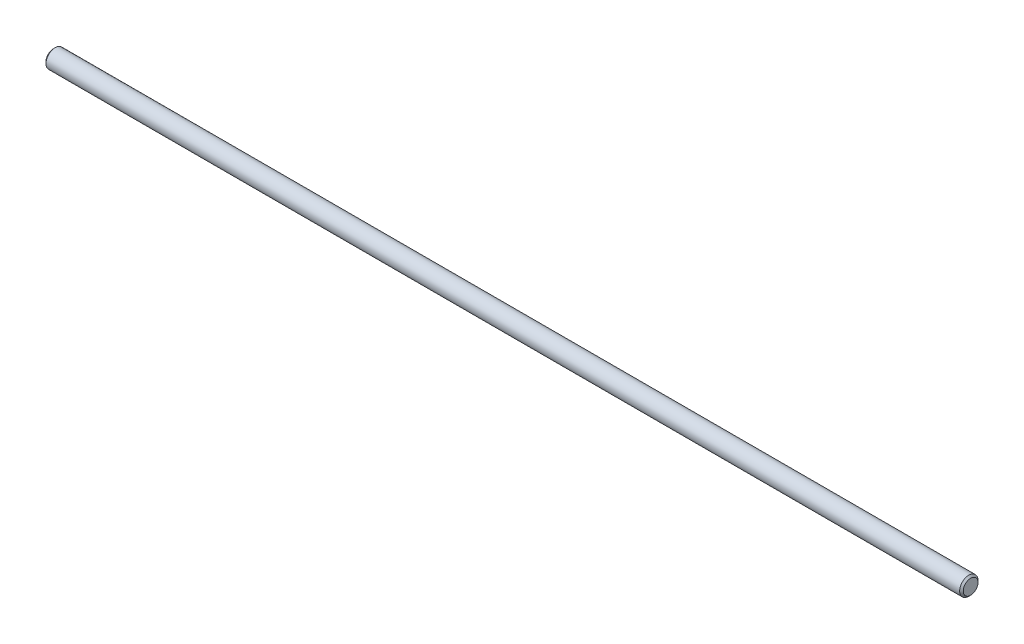
ISO-10303-21;
HEADER;
FILE_DESCRIPTION(('STEP AP214'),'2;1');
FILE_NAME('part.step','',(''),(''),'','','');
FILE_SCHEMA(('AUTOMOTIVE_DESIGN { 1 0 10303 214 1 1 1 1 }'));
ENDSEC;
DATA;
#1=APPLICATION_CONTEXT('core data for automotive mechanical design processes');
#2=APPLICATION_PROTOCOL_DEFINITION('international standard','automotive_design',2000,#1);
#3=PRODUCT_CONTEXT('',#1,'mechanical');
#4=PRODUCT('Part','Part','',(#3));
#5=PRODUCT_RELATED_PRODUCT_CATEGORY('part','',(#4));
#6=PRODUCT_DEFINITION_FORMATION('','',#4);
#7=PRODUCT_DEFINITION_CONTEXT('part definition',#1,'design');
#8=PRODUCT_DEFINITION('design','',#6,#7);
#9=PRODUCT_DEFINITION_SHAPE('','',#8);
#10=(LENGTH_UNIT() NAMED_UNIT(*) SI_UNIT(.MILLI.,.METRE.));
#11=(NAMED_UNIT(*) PLANE_ANGLE_UNIT() SI_UNIT($,.RADIAN.));
#12=(NAMED_UNIT(*) SI_UNIT($,.STERADIAN.) SOLID_ANGLE_UNIT());
#13=UNCERTAINTY_MEASURE_WITH_UNIT(LENGTH_MEASURE(1.E-05),#10,'distance_accuracy_value','');
#14=(GEOMETRIC_REPRESENTATION_CONTEXT(3) GLOBAL_UNCERTAINTY_ASSIGNED_CONTEXT((#13)) GLOBAL_UNIT_ASSIGNED_CONTEXT((#10,
#11,#12)) REPRESENTATION_CONTEXT('',''));
#15=CARTESIAN_POINT('',(0.,0.,0.));
#16=DIRECTION('',(0.,0.,1.));
#17=DIRECTION('',(1.,0.,0.));
#18=AXIS2_PLACEMENT_3D('',#15,#16,#17);
#19=CARTESIAN_POINT('',(0.,0.,0.));
#20=DIRECTION('',(1.,0.,0.));
#21=DIRECTION('',(0.,0.,-1.));
#22=AXIS2_PLACEMENT_3D('',#19,#20,#21);
#23=PLANE('',#22);
#24=CARTESIAN_POINT('',(0.,0.,0.));
#25=DIRECTION('',(-1.,0.,0.));
#26=DIRECTION('',(0.,0.,1.));
#27=AXIS2_PLACEMENT_3D('',#24,#25,#26);
#28=CIRCLE('',#27,2.00999999999998);
#29=CARTESIAN_POINT('',(0.,0.,2.00999999999998));
#30=VERTEX_POINT('',#29);
#31=EDGE_CURVE('E10',#30,#30,#28,.T.);
#32=ORIENTED_EDGE('',*,*,#31,.T.);
#33=EDGE_LOOP('',(#32));
#34=FACE_BOUND('',#33,.T.);
#35=ADVANCED_FACE('F45',(#34),#23,.F.);
#36=CARTESIAN_POINT('',(0.489999999999991,0.,0.));
#37=DIRECTION('',(1.,0.,0.));
#38=DIRECTION('',(0.,0.,-1.));
#39=AXIS2_PLACEMENT_3D('',#36,#37,#38);
#40=CONICAL_SURFACE('',#39,2.5,0.78539816339748);
#41=ORIENTED_EDGE('',*,*,#31,.F.);
#42=EDGE_LOOP('',(#41));
#43=FACE_BOUND('',#42,.T.);
#44=CARTESIAN_POINT('',(0.489999999999991,0.,0.));
#45=DIRECTION('',(-1.,0.,0.));
#46=DIRECTION('',(0.,0.,1.));
#47=AXIS2_PLACEMENT_3D('',#44,#45,#46);
#48=CIRCLE('',#47,2.5);
#49=CARTESIAN_POINT('',(0.489999999999991,0.,2.5));
#50=VERTEX_POINT('',#49);
#51=EDGE_CURVE('E51',#50,#50,#48,.T.);
#52=ORIENTED_EDGE('',*,*,#51,.T.);
#53=EDGE_LOOP('',(#52));
#54=FACE_BOUND('',#53,.T.);
#55=ADVANCED_FACE('F77',(#43,#54),#40,.T.);
#56=CARTESIAN_POINT('',(0.,0.,0.));
#57=DIRECTION('',(-1.,0.,0.));
#58=DIRECTION('',(0.,0.,1.));
#59=AXIS2_PLACEMENT_3D('',#56,#57,#58);
#60=CYLINDRICAL_SURFACE('',#59,2.5);
#61=ORIENTED_EDGE('',*,*,#51,.F.);
#62=EDGE_LOOP('',(#61));
#63=FACE_BOUND('',#62,.T.);
#64=CARTESIAN_POINT('',(249.51,0.,0.));
#65=DIRECTION('',(-1.,0.,0.));
#66=DIRECTION('',(0.,0.,1.));
#67=AXIS2_PLACEMENT_3D('',#64,#65,#66);
#68=CIRCLE('',#67,2.5);
#69=CARTESIAN_POINT('',(249.51,0.,2.5));
#70=VERTEX_POINT('',#69);
#71=EDGE_CURVE('E55',#70,#70,#68,.T.);
#72=ORIENTED_EDGE('',*,*,#71,.T.);
#73=EDGE_LOOP('',(#72));
#74=FACE_BOUND('',#73,.T.);
#75=ADVANCED_FACE('F73',(#63,#74),#60,.T.);
#76=CARTESIAN_POINT('',(250.,0.,0.));
#77=DIRECTION('',(-1.,0.,0.));
#78=DIRECTION('',(0.,0.,1.));
#79=AXIS2_PLACEMENT_3D('',#76,#77,#78);
#80=CONICAL_SURFACE('',#79,2.00999999999998,0.785398163397481);
#81=ORIENTED_EDGE('',*,*,#71,.F.);
#82=EDGE_LOOP('',(#81));
#83=FACE_BOUND('',#82,.T.);
#84=CARTESIAN_POINT('',(250.,0.,0.));
#85=DIRECTION('',(-1.,0.,0.));
#86=DIRECTION('',(0.,0.,1.));
#87=AXIS2_PLACEMENT_3D('',#84,#85,#86);
#88=CIRCLE('',#87,2.00999999999998);
#89=CARTESIAN_POINT('',(250.,0.,2.00999999999998));
#90=VERTEX_POINT('',#89);
#91=EDGE_CURVE('E59',#90,#90,#88,.T.);
#92=ORIENTED_EDGE('',*,*,#91,.T.);
#93=EDGE_LOOP('',(#92));
#94=FACE_BOUND('',#93,.T.);
#95=ADVANCED_FACE('F65',(#83,#94),#80,.T.);
#96=CARTESIAN_POINT('',(250.,2.00999999999998,0.));
#97=DIRECTION('',(-1.,0.,0.));
#98=DIRECTION('',(0.,0.,1.));
#99=AXIS2_PLACEMENT_3D('',#96,#97,#98);
#100=PLANE('',#99);
#101=ORIENTED_EDGE('',*,*,#91,.F.);
#102=EDGE_LOOP('',(#101));
#103=FACE_BOUND('',#102,.T.);
#104=ADVANCED_FACE('F67',(#103),#100,.F.);
#105=CLOSED_SHELL('',(#35,#55,#75,#95,#104));
#106=MANIFOLD_SOLID_BREP('B2',#105);
#107=ADVANCED_BREP_SHAPE_REPRESENTATION('',(#18,#106),#14);
#108=SHAPE_DEFINITION_REPRESENTATION(#9,#107);
ENDSEC;
END-ISO-10303-21;
